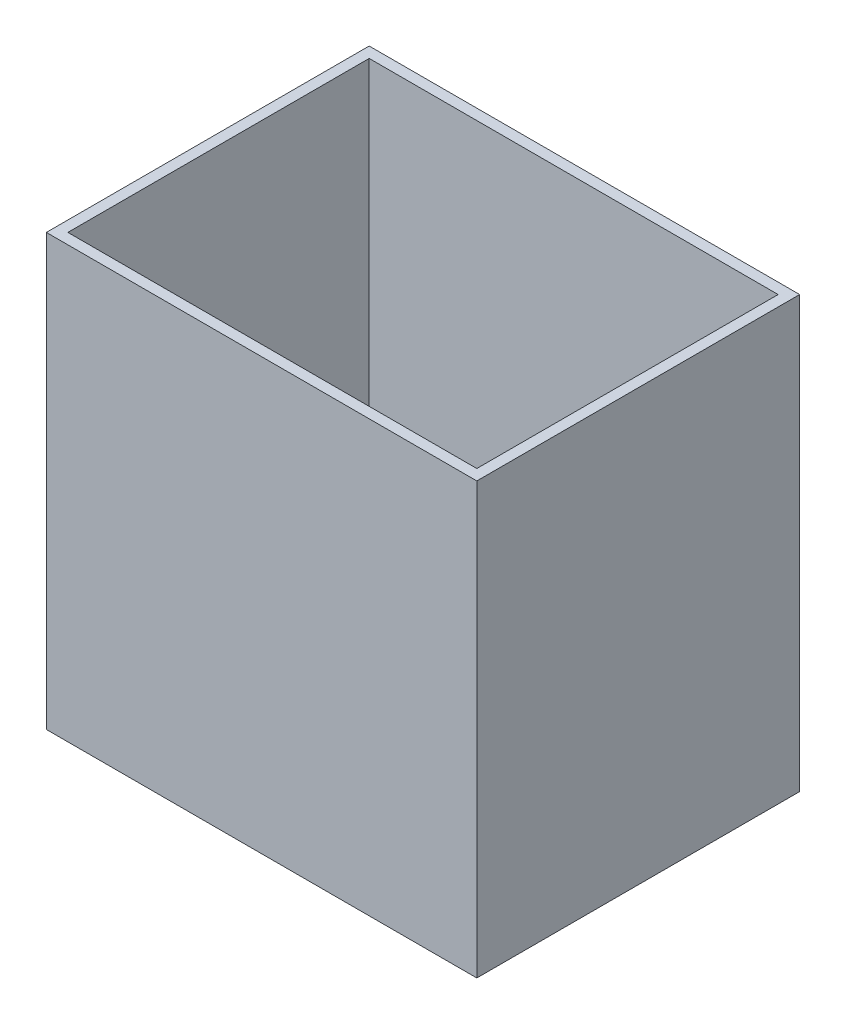
ISO-10303-21;
HEADER;
FILE_DESCRIPTION(('STEP AP214'),'2;1');
FILE_NAME('part.step','',(''),(''),'','','');
FILE_SCHEMA(('AUTOMOTIVE_DESIGN { 1 0 10303 214 1 1 1 1 }'));
ENDSEC;
DATA;
#1=APPLICATION_CONTEXT('core data for automotive mechanical design processes');
#2=APPLICATION_PROTOCOL_DEFINITION('international standard','automotive_design',2000,#1);
#3=PRODUCT_CONTEXT('',#1,'mechanical');
#4=PRODUCT('Part','Part','',(#3));
#5=PRODUCT_RELATED_PRODUCT_CATEGORY('part','',(#4));
#6=PRODUCT_DEFINITION_FORMATION('','',#4);
#7=PRODUCT_DEFINITION_CONTEXT('part definition',#1,'design');
#8=PRODUCT_DEFINITION('design','',#6,#7);
#9=PRODUCT_DEFINITION_SHAPE('','',#8);
#10=(LENGTH_UNIT() NAMED_UNIT(*) SI_UNIT(.MILLI.,.METRE.));
#11=(NAMED_UNIT(*) PLANE_ANGLE_UNIT() SI_UNIT($,.RADIAN.));
#12=(NAMED_UNIT(*) SI_UNIT($,.STERADIAN.) SOLID_ANGLE_UNIT());
#13=UNCERTAINTY_MEASURE_WITH_UNIT(LENGTH_MEASURE(1.E-05),#10,'distance_accuracy_value','');
#14=(GEOMETRIC_REPRESENTATION_CONTEXT(3) GLOBAL_UNCERTAINTY_ASSIGNED_CONTEXT((#13)) GLOBAL_UNIT_ASSIGNED_CONTEXT((#10,
#11,#12)) REPRESENTATION_CONTEXT('',''));
#15=CARTESIAN_POINT('',(0.,0.,0.));
#16=DIRECTION('',(0.,0.,1.));
#17=DIRECTION('',(1.,0.,0.));
#18=AXIS2_PLACEMENT_3D('',#15,#16,#17);
#19=CARTESIAN_POINT('',(0.,80.,0.));
#20=DIRECTION('',(0.,-1.,0.));
#21=DIRECTION('',(0.,0.,-1.));
#22=AXIS2_PLACEMENT_3D('',#19,#20,#21);
#23=PLANE('',#22);
#24=DIRECTION('',(0.,0.,1.));
#25=VECTOR('',#24,1.);
#26=CARTESIAN_POINT('',(0.,80.,0.));
#27=LINE('',#26,#25);
#28=CARTESIAN_POINT('',(0.,80.,-60.));
#29=VERTEX_POINT('',#28);
#30=CARTESIAN_POINT('',(0.,80.,0.));
#31=VERTEX_POINT('',#30);
#32=EDGE_CURVE('E161',#29,#31,#27,.T.);
#33=ORIENTED_EDGE('',*,*,#32,.T.);
#34=DIRECTION('',(1.,0.,0.));
#35=VECTOR('',#34,1.);
#36=CARTESIAN_POINT('',(0.,80.,0.));
#37=LINE('',#36,#35);
#38=CARTESIAN_POINT('',(80.,80.,0.));
#39=VERTEX_POINT('',#38);
#40=EDGE_CURVE('E96',#31,#39,#37,.T.);
#41=ORIENTED_EDGE('',*,*,#40,.T.);
#42=DIRECTION('',(0.,0.,-1.));
#43=VECTOR('',#42,1.);
#44=CARTESIAN_POINT('',(80.,80.,0.));
#45=LINE('',#44,#43);
#46=CARTESIAN_POINT('',(80.,80.,-60.));
#47=VERTEX_POINT('',#46);
#48=EDGE_CURVE('E166',#39,#47,#45,.T.);
#49=ORIENTED_EDGE('',*,*,#48,.T.);
#50=DIRECTION('',(-1.,0.,0.));
#51=VECTOR('',#50,1.);
#52=CARTESIAN_POINT('',(0.,80.,-60.));
#53=LINE('',#52,#51);
#54=EDGE_CURVE('E68',#47,#29,#53,.T.);
#55=ORIENTED_EDGE('',*,*,#54,.T.);
#56=EDGE_LOOP('',(#33,#41,#49,#55));
#57=FACE_BOUND('',#56,.T.);
#58=DIRECTION('',(0.,0.,1.));
#59=VECTOR('',#58,1.);
#60=CARTESIAN_POINT('',(2.,80.,0.));
#61=LINE('',#60,#59);
#62=CARTESIAN_POINT('',(2.,80.,-58.));
#63=VERTEX_POINT('',#62);
#64=CARTESIAN_POINT('',(2.,80.,-2.));
#65=VERTEX_POINT('',#64);
#66=EDGE_CURVE('E145',#63,#65,#61,.T.);
#67=ORIENTED_EDGE('',*,*,#66,.F.);
#68=DIRECTION('',(-1.,0.,0.));
#69=VECTOR('',#68,1.);
#70=CARTESIAN_POINT('',(0.,80.,-58.));
#71=LINE('',#70,#69);
#72=CARTESIAN_POINT('',(78.,80.,-58.));
#73=VERTEX_POINT('',#72);
#74=EDGE_CURVE('E158',#73,#63,#71,.T.);
#75=ORIENTED_EDGE('',*,*,#74,.F.);
#76=DIRECTION('',(0.,0.,-1.));
#77=VECTOR('',#76,1.);
#78=CARTESIAN_POINT('',(78.,80.,0.));
#79=LINE('',#78,#77);
#80=CARTESIAN_POINT('',(78.,80.,-2.));
#81=VERTEX_POINT('',#80);
#82=EDGE_CURVE('E155',#81,#73,#79,.T.);
#83=ORIENTED_EDGE('',*,*,#82,.F.);
#84=DIRECTION('',(1.,0.,0.));
#85=VECTOR('',#84,1.);
#86=CARTESIAN_POINT('',(0.,80.,-2.));
#87=LINE('',#86,#85);
#88=EDGE_CURVE('E134',#65,#81,#87,.T.);
#89=ORIENTED_EDGE('',*,*,#88,.F.);
#90=EDGE_LOOP('',(#67,#75,#83,#89));
#91=FACE_BOUND('',#90,.T.);
#92=ADVANCED_FACE('F43',(#57,#91),#23,.F.);
#93=CARTESIAN_POINT('',(0.,80.,0.));
#94=DIRECTION('',(1.,0.,0.));
#95=DIRECTION('',(0.,0.,-1.));
#96=AXIS2_PLACEMENT_3D('',#93,#94,#95);
#97=PLANE('',#96);
#98=DIRECTION('',(0.,0.,1.));
#99=VECTOR('',#98,1.);
#100=CARTESIAN_POINT('',(0.,0.,0.));
#101=LINE('',#100,#99);
#102=CARTESIAN_POINT('',(0.,0.,-60.));
#103=VERTEX_POINT('',#102);
#104=CARTESIAN_POINT('',(0.,0.,0.));
#105=VERTEX_POINT('',#104);
#106=EDGE_CURVE('E172',#103,#105,#101,.T.);
#107=ORIENTED_EDGE('',*,*,#106,.T.);
#108=DIRECTION('',(0.,-1.,0.));
#109=VECTOR('',#108,1.);
#110=CARTESIAN_POINT('',(0.,80.,0.));
#111=LINE('',#110,#109);
#112=EDGE_CURVE('E11',#31,#105,#111,.T.);
#113=ORIENTED_EDGE('',*,*,#112,.F.);
#114=ORIENTED_EDGE('',*,*,#32,.F.);
#115=DIRECTION('',(0.,-1.,0.));
#116=VECTOR('',#115,1.);
#117=CARTESIAN_POINT('',(0.,80.,-60.));
#118=LINE('',#117,#116);
#119=EDGE_CURVE('E171',#29,#103,#118,.T.);
#120=ORIENTED_EDGE('',*,*,#119,.T.);
#121=EDGE_LOOP('',(#107,#113,#114,#120));
#122=FACE_BOUND('',#121,.T.);
#123=ADVANCED_FACE('F45',(#122),#97,.F.);
#124=CARTESIAN_POINT('',(0.,80.,0.));
#125=DIRECTION('',(0.,0.,-1.));
#126=DIRECTION('',(-1.,0.,0.));
#127=AXIS2_PLACEMENT_3D('',#124,#125,#126);
#128=PLANE('',#127);
#129=DIRECTION('',(1.,0.,0.));
#130=VECTOR('',#129,1.);
#131=CARTESIAN_POINT('',(0.,0.,0.));
#132=LINE('',#131,#130);
#133=CARTESIAN_POINT('',(80.,0.,0.));
#134=VERTEX_POINT('',#133);
#135=EDGE_CURVE('E176',#105,#134,#132,.T.);
#136=ORIENTED_EDGE('',*,*,#135,.T.);
#137=DIRECTION('',(0.,-1.,0.));
#138=VECTOR('',#137,1.);
#139=CARTESIAN_POINT('',(80.,80.,0.));
#140=LINE('',#139,#138);
#141=EDGE_CURVE('E52',#39,#134,#140,.T.);
#142=ORIENTED_EDGE('',*,*,#141,.F.);
#143=ORIENTED_EDGE('',*,*,#40,.F.);
#144=ORIENTED_EDGE('',*,*,#112,.T.);
#145=EDGE_LOOP('',(#136,#142,#143,#144));
#146=FACE_BOUND('',#145,.T.);
#147=ADVANCED_FACE('F210',(#146),#128,.F.);
#148=CARTESIAN_POINT('',(80.,80.,0.));
#149=DIRECTION('',(-1.,0.,0.));
#150=DIRECTION('',(0.,0.,1.));
#151=AXIS2_PLACEMENT_3D('',#148,#149,#150);
#152=PLANE('',#151);
#153=DIRECTION('',(0.,0.,-1.));
#154=VECTOR('',#153,1.);
#155=CARTESIAN_POINT('',(80.,0.,0.));
#156=LINE('',#155,#154);
#157=CARTESIAN_POINT('',(80.,0.,-60.));
#158=VERTEX_POINT('',#157);
#159=EDGE_CURVE('E179',#134,#158,#156,.T.);
#160=ORIENTED_EDGE('',*,*,#159,.T.);
#161=DIRECTION('',(0.,-1.,0.));
#162=VECTOR('',#161,1.);
#163=CARTESIAN_POINT('',(80.,80.,-60.));
#164=LINE('',#163,#162);
#165=EDGE_CURVE('E186',#47,#158,#164,.T.);
#166=ORIENTED_EDGE('',*,*,#165,.F.);
#167=ORIENTED_EDGE('',*,*,#48,.F.);
#168=ORIENTED_EDGE('',*,*,#141,.T.);
#169=EDGE_LOOP('',(#160,#166,#167,#168));
#170=FACE_BOUND('',#169,.T.);
#171=ADVANCED_FACE('F193',(#170),#152,.F.);
#172=CARTESIAN_POINT('',(0.,80.,-60.));
#173=DIRECTION('',(0.,0.,1.));
#174=DIRECTION('',(1.,0.,0.));
#175=AXIS2_PLACEMENT_3D('',#172,#173,#174);
#176=PLANE('',#175);
#177=DIRECTION('',(-1.,0.,0.));
#178=VECTOR('',#177,1.);
#179=CARTESIAN_POINT('',(0.,0.,-60.));
#180=LINE('',#179,#178);
#181=EDGE_CURVE('E89',#158,#103,#180,.T.);
#182=ORIENTED_EDGE('',*,*,#181,.T.);
#183=ORIENTED_EDGE('',*,*,#119,.F.);
#184=ORIENTED_EDGE('',*,*,#54,.F.);
#185=ORIENTED_EDGE('',*,*,#165,.T.);
#186=EDGE_LOOP('',(#182,#183,#184,#185));
#187=FACE_BOUND('',#186,.T.);
#188=ADVANCED_FACE('F201',(#187),#176,.F.);
#189=CARTESIAN_POINT('',(0.,0.,0.));
#190=DIRECTION('',(0.,-1.,0.));
#191=DIRECTION('',(0.,0.,-1.));
#192=AXIS2_PLACEMENT_3D('',#189,#190,#191);
#193=PLANE('',#192);
#194=ORIENTED_EDGE('',*,*,#106,.F.);
#195=ORIENTED_EDGE('',*,*,#181,.F.);
#196=ORIENTED_EDGE('',*,*,#159,.F.);
#197=ORIENTED_EDGE('',*,*,#135,.F.);
#198=EDGE_LOOP('',(#194,#195,#196,#197));
#199=FACE_BOUND('',#198,.T.);
#200=ADVANCED_FACE('F197',(#199),#193,.T.);
#201=CARTESIAN_POINT('',(2.,80.,0.));
#202=DIRECTION('',(1.,0.,0.));
#203=DIRECTION('',(0.,0.,-1.));
#204=AXIS2_PLACEMENT_3D('',#201,#202,#203);
#205=PLANE('',#204);
#206=DIRECTION('',(0.,0.,1.));
#207=VECTOR('',#206,1.);
#208=CARTESIAN_POINT('',(2.,2.,0.));
#209=LINE('',#208,#207);
#210=CARTESIAN_POINT('',(2.,2.,-58.));
#211=VERTEX_POINT('',#210);
#212=CARTESIAN_POINT('',(2.,2.,-2.));
#213=VERTEX_POINT('',#212);
#214=EDGE_CURVE('E124',#211,#213,#209,.T.);
#215=ORIENTED_EDGE('',*,*,#214,.F.);
#216=DIRECTION('',(0.,-1.,0.));
#217=VECTOR('',#216,1.);
#218=CARTESIAN_POINT('',(2.,80.,-58.));
#219=LINE('',#218,#217);
#220=EDGE_CURVE('E149',#63,#211,#219,.T.);
#221=ORIENTED_EDGE('',*,*,#220,.F.);
#222=ORIENTED_EDGE('',*,*,#66,.T.);
#223=DIRECTION('',(0.,-1.,0.));
#224=VECTOR('',#223,1.);
#225=CARTESIAN_POINT('',(2.,80.,-2.));
#226=LINE('',#225,#224);
#227=EDGE_CURVE('E138',#65,#213,#226,.T.);
#228=ORIENTED_EDGE('',*,*,#227,.T.);
#229=EDGE_LOOP('',(#215,#221,#222,#228));
#230=FACE_BOUND('',#229,.T.);
#231=ADVANCED_FACE('F208',(#230),#205,.T.);
#232=CARTESIAN_POINT('',(0.,80.,-2.));
#233=DIRECTION('',(0.,0.,-1.));
#234=DIRECTION('',(-1.,0.,0.));
#235=AXIS2_PLACEMENT_3D('',#232,#233,#234);
#236=PLANE('',#235);
#237=DIRECTION('',(1.,0.,0.));
#238=VECTOR('',#237,1.);
#239=CARTESIAN_POINT('',(0.,2.,-2.));
#240=LINE('',#239,#238);
#241=CARTESIAN_POINT('',(78.,2.,-2.));
#242=VERTEX_POINT('',#241);
#243=EDGE_CURVE('E118',#213,#242,#240,.T.);
#244=ORIENTED_EDGE('',*,*,#243,.F.);
#245=ORIENTED_EDGE('',*,*,#227,.F.);
#246=ORIENTED_EDGE('',*,*,#88,.T.);
#247=DIRECTION('',(0.,-1.,0.));
#248=VECTOR('',#247,1.);
#249=CARTESIAN_POINT('',(78.,80.,-2.));
#250=LINE('',#249,#248);
#251=EDGE_CURVE('E131',#81,#242,#250,.T.);
#252=ORIENTED_EDGE('',*,*,#251,.T.);
#253=EDGE_LOOP('',(#244,#245,#246,#252));
#254=FACE_BOUND('',#253,.T.);
#255=ADVANCED_FACE('F132',(#254),#236,.T.);
#256=CARTESIAN_POINT('',(78.,80.,0.));
#257=DIRECTION('',(-1.,0.,0.));
#258=DIRECTION('',(0.,0.,1.));
#259=AXIS2_PLACEMENT_3D('',#256,#257,#258);
#260=PLANE('',#259);
#261=DIRECTION('',(0.,0.,-1.));
#262=VECTOR('',#261,1.);
#263=CARTESIAN_POINT('',(78.,2.,0.));
#264=LINE('',#263,#262);
#265=CARTESIAN_POINT('',(78.,2.,-58.));
#266=VERTEX_POINT('',#265);
#267=EDGE_CURVE('E122',#242,#266,#264,.T.);
#268=ORIENTED_EDGE('',*,*,#267,.F.);
#269=ORIENTED_EDGE('',*,*,#251,.F.);
#270=ORIENTED_EDGE('',*,*,#82,.T.);
#271=DIRECTION('',(0.,-1.,0.));
#272=VECTOR('',#271,1.);
#273=CARTESIAN_POINT('',(78.,80.,-58.));
#274=LINE('',#273,#272);
#275=EDGE_CURVE('E59',#73,#266,#274,.T.);
#276=ORIENTED_EDGE('',*,*,#275,.T.);
#277=EDGE_LOOP('',(#268,#269,#270,#276));
#278=FACE_BOUND('',#277,.T.);
#279=ADVANCED_FACE('F140',(#278),#260,.T.);
#280=CARTESIAN_POINT('',(0.,80.,-58.));
#281=DIRECTION('',(0.,0.,1.));
#282=DIRECTION('',(1.,0.,0.));
#283=AXIS2_PLACEMENT_3D('',#280,#281,#282);
#284=PLANE('',#283);
#285=DIRECTION('',(-1.,0.,0.));
#286=VECTOR('',#285,1.);
#287=CARTESIAN_POINT('',(0.,2.,-58.));
#288=LINE('',#287,#286);
#289=EDGE_CURVE('E142',#266,#211,#288,.T.);
#290=ORIENTED_EDGE('',*,*,#289,.F.);
#291=ORIENTED_EDGE('',*,*,#275,.F.);
#292=ORIENTED_EDGE('',*,*,#74,.T.);
#293=ORIENTED_EDGE('',*,*,#220,.T.);
#294=EDGE_LOOP('',(#290,#291,#292,#293));
#295=FACE_BOUND('',#294,.T.);
#296=ADVANCED_FACE('F221',(#295),#284,.T.);
#297=CARTESIAN_POINT('',(0.,2.,0.));
#298=DIRECTION('',(0.,-1.,0.));
#299=DIRECTION('',(0.,0.,-1.));
#300=AXIS2_PLACEMENT_3D('',#297,#298,#299);
#301=PLANE('',#300);
#302=ORIENTED_EDGE('',*,*,#214,.T.);
#303=ORIENTED_EDGE('',*,*,#243,.T.);
#304=ORIENTED_EDGE('',*,*,#267,.T.);
#305=ORIENTED_EDGE('',*,*,#289,.T.);
#306=EDGE_LOOP('',(#302,#303,#304,#305));
#307=FACE_BOUND('',#306,.T.);
#308=ADVANCED_FACE('F120',(#307),#301,.F.);
#309=CLOSED_SHELL('',(#92,#123,#147,#171,#188,#200,#231,#255,#279,#296,#308));
#310=MANIFOLD_SOLID_BREP('B2',#309);
#311=ADVANCED_BREP_SHAPE_REPRESENTATION('',(#18,#310),#14);
#312=SHAPE_DEFINITION_REPRESENTATION(#9,#311);
ENDSEC;
END-ISO-10303-21;
